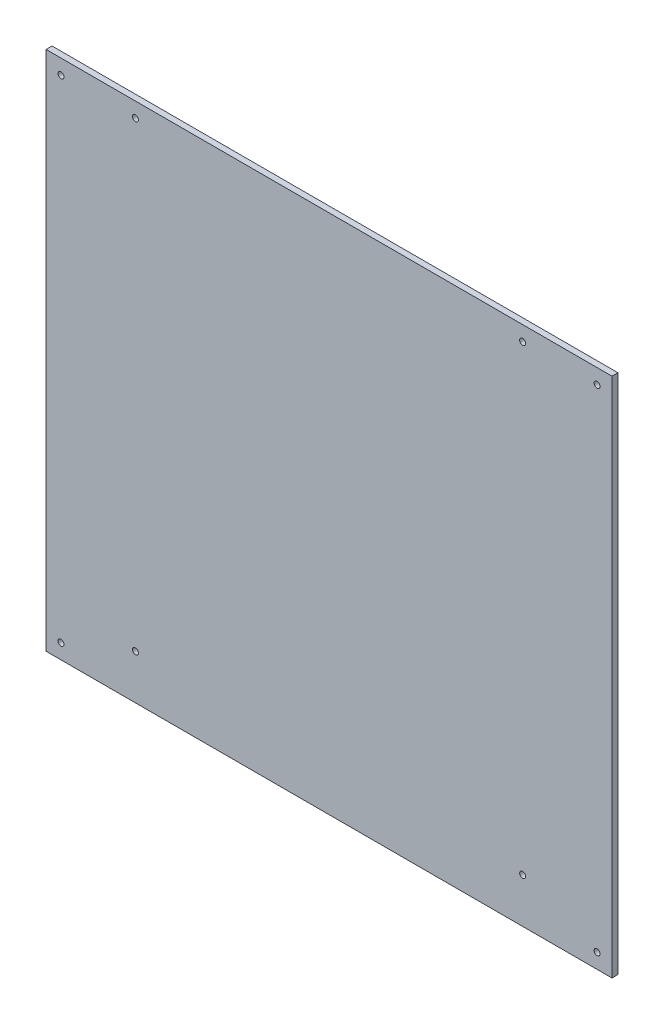
ISO-10303-21;
HEADER;
FILE_DESCRIPTION(('STEP AP214'),'2;1');
FILE_NAME('part.step','',(''),(''),'','','');
FILE_SCHEMA(('AUTOMOTIVE_DESIGN { 1 0 10303 214 1 1 1 1 }'));
ENDSEC;
DATA;
#1=APPLICATION_CONTEXT('core data for automotive mechanical design processes');
#2=APPLICATION_PROTOCOL_DEFINITION('international standard','automotive_design',2000,#1);
#3=PRODUCT_CONTEXT('',#1,'mechanical');
#4=PRODUCT('Part','Part','',(#3));
#5=PRODUCT_RELATED_PRODUCT_CATEGORY('part','',(#4));
#6=PRODUCT_DEFINITION_FORMATION('','',#4);
#7=PRODUCT_DEFINITION_CONTEXT('part definition',#1,'design');
#8=PRODUCT_DEFINITION('design','',#6,#7);
#9=PRODUCT_DEFINITION_SHAPE('','',#8);
#10=(LENGTH_UNIT() NAMED_UNIT(*) SI_UNIT(.MILLI.,.METRE.));
#11=(NAMED_UNIT(*) PLANE_ANGLE_UNIT() SI_UNIT($,.RADIAN.));
#12=(NAMED_UNIT(*) SI_UNIT($,.STERADIAN.) SOLID_ANGLE_UNIT());
#13=UNCERTAINTY_MEASURE_WITH_UNIT(LENGTH_MEASURE(1.E-05),#10,'distance_accuracy_value','');
#14=(GEOMETRIC_REPRESENTATION_CONTEXT(3) GLOBAL_UNCERTAINTY_ASSIGNED_CONTEXT((#13)) GLOBAL_UNIT_ASSIGNED_CONTEXT((#10,
#11,#12)) REPRESENTATION_CONTEXT('',''));
#15=CARTESIAN_POINT('',(0.,0.,0.));
#16=DIRECTION('',(0.,0.,1.));
#17=DIRECTION('',(1.,0.,0.));
#18=AXIS2_PLACEMENT_3D('',#15,#16,#17);
#19=CARTESIAN_POINT('',(0.,0.,4.));
#20=DIRECTION('',(0.,0.,1.));
#21=DIRECTION('',(1.,0.,0.));
#22=AXIS2_PLACEMENT_3D('',#19,#20,#21);
#23=PLANE('',#22);
#24=CARTESIAN_POINT('',(-179.999999999997,-165.,4.));
#25=DIRECTION('',(0.,0.,1.));
#26=DIRECTION('',(1.,0.,0.));
#27=AXIS2_PLACEMENT_3D('',#24,#25,#26);
#28=CIRCLE('',#27,2.);
#29=CARTESIAN_POINT('',(-177.999999999997,-165.,4.));
#30=VERTEX_POINT('',#29);
#31=EDGE_CURVE('E145',#30,#30,#28,.T.);
#32=ORIENTED_EDGE('',*,*,#31,.F.);
#33=EDGE_LOOP('',(#32));
#34=FACE_BOUND('',#33,.T.);
#35=CARTESIAN_POINT('',(180.,-165.,4.));
#36=DIRECTION('',(0.,0.,1.));
#37=DIRECTION('',(1.,0.,0.));
#38=AXIS2_PLACEMENT_3D('',#35,#36,#37);
#39=CIRCLE('',#38,2.);
#40=CARTESIAN_POINT('',(182.,-165.,4.));
#41=VERTEX_POINT('',#40);
#42=EDGE_CURVE('E133',#41,#41,#39,.T.);
#43=ORIENTED_EDGE('',*,*,#42,.F.);
#44=EDGE_LOOP('',(#43));
#45=FACE_BOUND('',#44,.T.);
#46=CARTESIAN_POINT('',(180.,165.,4.));
#47=DIRECTION('',(0.,0.,1.));
#48=DIRECTION('',(1.,0.,0.));
#49=AXIS2_PLACEMENT_3D('',#46,#47,#48);
#50=CIRCLE('',#49,2.);
#51=CARTESIAN_POINT('',(182.,165.,4.));
#52=VERTEX_POINT('',#51);
#53=EDGE_CURVE('E121',#52,#52,#50,.T.);
#54=ORIENTED_EDGE('',*,*,#53,.F.);
#55=EDGE_LOOP('',(#54));
#56=FACE_BOUND('',#55,.T.);
#57=CARTESIAN_POINT('',(-180.,165.,4.));
#58=DIRECTION('',(0.,0.,1.));
#59=DIRECTION('',(1.,0.,0.));
#60=AXIS2_PLACEMENT_3D('',#57,#58,#59);
#61=CIRCLE('',#60,2.);
#62=CARTESIAN_POINT('',(-178.,165.,4.));
#63=VERTEX_POINT('',#62);
#64=EDGE_CURVE('E100',#63,#63,#61,.T.);
#65=ORIENTED_EDGE('',*,*,#64,.F.);
#66=EDGE_LOOP('',(#65));
#67=FACE_BOUND('',#66,.T.);
#68=DIRECTION('',(0.,-1.,0.));
#69=VECTOR('',#68,1.);
#70=CARTESIAN_POINT('',(-190.,-175.,4.));
#71=LINE('',#70,#69);
#72=CARTESIAN_POINT('',(-190.,175.,4.));
#73=VERTEX_POINT('',#72);
#74=CARTESIAN_POINT('',(-190.,-175.,4.));
#75=VERTEX_POINT('',#74);
#76=EDGE_CURVE('E85',#73,#75,#71,.T.);
#77=ORIENTED_EDGE('',*,*,#76,.T.);
#78=DIRECTION('',(1.,0.,0.));
#79=VECTOR('',#78,1.);
#80=CARTESIAN_POINT('',(190.,-175.,4.));
#81=LINE('',#80,#79);
#82=CARTESIAN_POINT('',(190.,-175.,4.));
#83=VERTEX_POINT('',#82);
#84=EDGE_CURVE('E80',#75,#83,#81,.T.);
#85=ORIENTED_EDGE('',*,*,#84,.T.);
#86=DIRECTION('',(0.,1.,0.));
#87=VECTOR('',#86,1.);
#88=CARTESIAN_POINT('',(190.,-175.,4.));
#89=LINE('',#88,#87);
#90=CARTESIAN_POINT('',(190.,175.,4.));
#91=VERTEX_POINT('',#90);
#92=EDGE_CURVE('E83',#83,#91,#89,.T.);
#93=ORIENTED_EDGE('',*,*,#92,.T.);
#94=DIRECTION('',(-1.,0.,0.));
#95=VECTOR('',#94,1.);
#96=CARTESIAN_POINT('',(190.,175.,4.));
#97=LINE('',#96,#95);
#98=EDGE_CURVE('E50',#91,#73,#97,.T.);
#99=ORIENTED_EDGE('',*,*,#98,.T.);
#100=EDGE_LOOP('',(#77,#85,#93,#99));
#101=FACE_BOUND('',#100,.T.);
#102=CARTESIAN_POINT('',(-130.,165.,4.));
#103=DIRECTION('',(0.,0.,1.));
#104=DIRECTION('',(1.,0.,0.));
#105=AXIS2_PLACEMENT_3D('',#102,#103,#104);
#106=CIRCLE('',#105,2.);
#107=CARTESIAN_POINT('',(-128.,165.,4.));
#108=VERTEX_POINT('',#107);
#109=EDGE_CURVE('E115',#108,#108,#106,.T.);
#110=ORIENTED_EDGE('',*,*,#109,.F.);
#111=EDGE_LOOP('',(#110));
#112=FACE_BOUND('',#111,.T.);
#113=CARTESIAN_POINT('',(130.,165.,4.));
#114=DIRECTION('',(0.,0.,1.));
#115=DIRECTION('',(1.,0.,0.));
#116=AXIS2_PLACEMENT_3D('',#113,#114,#115);
#117=CIRCLE('',#116,2.);
#118=CARTESIAN_POINT('',(132.,165.,4.));
#119=VERTEX_POINT('',#118);
#120=EDGE_CURVE('E127',#119,#119,#117,.T.);
#121=ORIENTED_EDGE('',*,*,#120,.F.);
#122=EDGE_LOOP('',(#121));
#123=FACE_BOUND('',#122,.T.);
#124=CARTESIAN_POINT('',(130.,-145.,4.));
#125=DIRECTION('',(0.,0.,1.));
#126=DIRECTION('',(1.,0.,0.));
#127=AXIS2_PLACEMENT_3D('',#124,#125,#126);
#128=CIRCLE('',#127,2.);
#129=CARTESIAN_POINT('',(132.,-145.,4.));
#130=VERTEX_POINT('',#129);
#131=EDGE_CURVE('E139',#130,#130,#128,.T.);
#132=ORIENTED_EDGE('',*,*,#131,.F.);
#133=EDGE_LOOP('',(#132));
#134=FACE_BOUND('',#133,.T.);
#135=CARTESIAN_POINT('',(-129.999999999997,-145.,4.));
#136=DIRECTION('',(0.,0.,1.));
#137=DIRECTION('',(1.,0.,0.));
#138=AXIS2_PLACEMENT_3D('',#135,#136,#137);
#139=CIRCLE('',#138,2.);
#140=CARTESIAN_POINT('',(-127.999999999997,-145.,4.));
#141=VERTEX_POINT('',#140);
#142=EDGE_CURVE('E151',#141,#141,#139,.T.);
#143=ORIENTED_EDGE('',*,*,#142,.F.);
#144=EDGE_LOOP('',(#143));
#145=FACE_BOUND('',#144,.T.);
#146=ADVANCED_FACE('F33',(#34,#45,#56,#67,#101,#112,#123,#134,#145),#23,.T.);
#147=CARTESIAN_POINT('',(0.,0.,0.));
#148=DIRECTION('',(0.,0.,1.));
#149=DIRECTION('',(1.,0.,0.));
#150=AXIS2_PLACEMENT_3D('',#147,#148,#149);
#151=PLANE('',#150);
#152=DIRECTION('',(0.,-1.,0.));
#153=VECTOR('',#152,1.);
#154=CARTESIAN_POINT('',(-190.,-175.,0.));
#155=LINE('',#154,#153);
#156=CARTESIAN_POINT('',(-190.,175.,0.));
#157=VERTEX_POINT('',#156);
#158=CARTESIAN_POINT('',(-190.,-175.,0.));
#159=VERTEX_POINT('',#158);
#160=EDGE_CURVE('E97',#157,#159,#155,.T.);
#161=ORIENTED_EDGE('',*,*,#160,.F.);
#162=DIRECTION('',(-1.,0.,0.));
#163=VECTOR('',#162,1.);
#164=CARTESIAN_POINT('',(190.,175.,0.));
#165=LINE('',#164,#163);
#166=CARTESIAN_POINT('',(190.,175.,0.));
#167=VERTEX_POINT('',#166);
#168=EDGE_CURVE('E73',#167,#157,#165,.T.);
#169=ORIENTED_EDGE('',*,*,#168,.F.);
#170=DIRECTION('',(0.,1.,0.));
#171=VECTOR('',#170,1.);
#172=CARTESIAN_POINT('',(190.,-175.,0.));
#173=LINE('',#172,#171);
#174=CARTESIAN_POINT('',(190.,-175.,0.));
#175=VERTEX_POINT('',#174);
#176=EDGE_CURVE('E67',#175,#167,#173,.T.);
#177=ORIENTED_EDGE('',*,*,#176,.F.);
#178=DIRECTION('',(1.,0.,0.));
#179=VECTOR('',#178,1.);
#180=CARTESIAN_POINT('',(190.,-175.,0.));
#181=LINE('',#180,#179);
#182=EDGE_CURVE('E89',#159,#175,#181,.T.);
#183=ORIENTED_EDGE('',*,*,#182,.F.);
#184=EDGE_LOOP('',(#161,#169,#177,#183));
#185=FACE_BOUND('',#184,.T.);
#186=CARTESIAN_POINT('',(-180.,165.,0.));
#187=DIRECTION('',(0.,0.,1.));
#188=DIRECTION('',(1.,0.,0.));
#189=AXIS2_PLACEMENT_3D('',#186,#187,#188);
#190=CIRCLE('',#189,2.);
#191=CARTESIAN_POINT('',(-178.,165.,0.));
#192=VERTEX_POINT('',#191);
#193=EDGE_CURVE('E112',#192,#192,#190,.T.);
#194=ORIENTED_EDGE('',*,*,#193,.T.);
#195=EDGE_LOOP('',(#194));
#196=FACE_BOUND('',#195,.T.);
#197=CARTESIAN_POINT('',(-130.,165.,0.));
#198=DIRECTION('',(0.,0.,1.));
#199=DIRECTION('',(1.,0.,0.));
#200=AXIS2_PLACEMENT_3D('',#197,#198,#199);
#201=CIRCLE('',#200,2.);
#202=CARTESIAN_POINT('',(-128.,165.,0.));
#203=VERTEX_POINT('',#202);
#204=EDGE_CURVE('E118',#203,#203,#201,.T.);
#205=ORIENTED_EDGE('',*,*,#204,.T.);
#206=EDGE_LOOP('',(#205));
#207=FACE_BOUND('',#206,.T.);
#208=CARTESIAN_POINT('',(180.,165.,0.));
#209=DIRECTION('',(0.,0.,1.));
#210=DIRECTION('',(1.,0.,0.));
#211=AXIS2_PLACEMENT_3D('',#208,#209,#210);
#212=CIRCLE('',#211,2.);
#213=CARTESIAN_POINT('',(182.,165.,0.));
#214=VERTEX_POINT('',#213);
#215=EDGE_CURVE('E124',#214,#214,#212,.T.);
#216=ORIENTED_EDGE('',*,*,#215,.T.);
#217=EDGE_LOOP('',(#216));
#218=FACE_BOUND('',#217,.T.);
#219=CARTESIAN_POINT('',(130.,165.,0.));
#220=DIRECTION('',(0.,0.,1.));
#221=DIRECTION('',(1.,0.,0.));
#222=AXIS2_PLACEMENT_3D('',#219,#220,#221);
#223=CIRCLE('',#222,2.);
#224=CARTESIAN_POINT('',(132.,165.,0.));
#225=VERTEX_POINT('',#224);
#226=EDGE_CURVE('E130',#225,#225,#223,.T.);
#227=ORIENTED_EDGE('',*,*,#226,.T.);
#228=EDGE_LOOP('',(#227));
#229=FACE_BOUND('',#228,.T.);
#230=CARTESIAN_POINT('',(180.,-165.,0.));
#231=DIRECTION('',(0.,0.,1.));
#232=DIRECTION('',(1.,0.,0.));
#233=AXIS2_PLACEMENT_3D('',#230,#231,#232);
#234=CIRCLE('',#233,2.);
#235=CARTESIAN_POINT('',(182.,-165.,0.));
#236=VERTEX_POINT('',#235);
#237=EDGE_CURVE('E136',#236,#236,#234,.T.);
#238=ORIENTED_EDGE('',*,*,#237,.T.);
#239=EDGE_LOOP('',(#238));
#240=FACE_BOUND('',#239,.T.);
#241=CARTESIAN_POINT('',(130.,-145.,0.));
#242=DIRECTION('',(0.,0.,1.));
#243=DIRECTION('',(1.,0.,0.));
#244=AXIS2_PLACEMENT_3D('',#241,#242,#243);
#245=CIRCLE('',#244,2.);
#246=CARTESIAN_POINT('',(132.,-145.,0.));
#247=VERTEX_POINT('',#246);
#248=EDGE_CURVE('E142',#247,#247,#245,.T.);
#249=ORIENTED_EDGE('',*,*,#248,.T.);
#250=EDGE_LOOP('',(#249));
#251=FACE_BOUND('',#250,.T.);
#252=CARTESIAN_POINT('',(-179.999999999997,-165.,0.));
#253=DIRECTION('',(0.,0.,1.));
#254=DIRECTION('',(1.,0.,0.));
#255=AXIS2_PLACEMENT_3D('',#252,#253,#254);
#256=CIRCLE('',#255,2.);
#257=CARTESIAN_POINT('',(-177.999999999997,-165.,0.));
#258=VERTEX_POINT('',#257);
#259=EDGE_CURVE('E148',#258,#258,#256,.T.);
#260=ORIENTED_EDGE('',*,*,#259,.T.);
#261=EDGE_LOOP('',(#260));
#262=FACE_BOUND('',#261,.T.);
#263=CARTESIAN_POINT('',(-129.999999999997,-145.,0.));
#264=DIRECTION('',(0.,0.,1.));
#265=DIRECTION('',(1.,0.,0.));
#266=AXIS2_PLACEMENT_3D('',#263,#264,#265);
#267=CIRCLE('',#266,2.);
#268=CARTESIAN_POINT('',(-127.999999999997,-145.,0.));
#269=VERTEX_POINT('',#268);
#270=EDGE_CURVE('E154',#269,#269,#267,.T.);
#271=ORIENTED_EDGE('',*,*,#270,.T.);
#272=EDGE_LOOP('',(#271));
#273=FACE_BOUND('',#272,.T.);
#274=ADVANCED_FACE('F108',(#185,#196,#207,#218,#229,#240,#251,#262,#273),#151,.F.);
#275=CARTESIAN_POINT('',(-190.,-175.,4.));
#276=DIRECTION('',(1.,0.,0.));
#277=DIRECTION('',(0.,0.,-1.));
#278=AXIS2_PLACEMENT_3D('',#275,#276,#277);
#279=PLANE('',#278);
#280=ORIENTED_EDGE('',*,*,#160,.T.);
#281=DIRECTION('',(0.,0.,-1.));
#282=VECTOR('',#281,1.);
#283=CARTESIAN_POINT('',(-190.,-175.,4.));
#284=LINE('',#283,#282);
#285=EDGE_CURVE('E11',#75,#159,#284,.T.);
#286=ORIENTED_EDGE('',*,*,#285,.F.);
#287=ORIENTED_EDGE('',*,*,#76,.F.);
#288=DIRECTION('',(0.,0.,-1.));
#289=VECTOR('',#288,1.);
#290=CARTESIAN_POINT('',(-190.,175.,4.));
#291=LINE('',#290,#289);
#292=EDGE_CURVE('E93',#73,#157,#291,.T.);
#293=ORIENTED_EDGE('',*,*,#292,.T.);
#294=EDGE_LOOP('',(#280,#286,#287,#293));
#295=FACE_BOUND('',#294,.T.);
#296=ADVANCED_FACE('F35',(#295),#279,.F.);
#297=CARTESIAN_POINT('',(190.,-175.,4.));
#298=DIRECTION('',(0.,1.,0.));
#299=DIRECTION('',(-1.,0.,0.));
#300=AXIS2_PLACEMENT_3D('',#297,#298,#299);
#301=PLANE('',#300);
#302=ORIENTED_EDGE('',*,*,#182,.T.);
#303=DIRECTION('',(0.,0.,-1.));
#304=VECTOR('',#303,1.);
#305=CARTESIAN_POINT('',(190.,-175.,4.));
#306=LINE('',#305,#304);
#307=EDGE_CURVE('E42',#83,#175,#306,.T.);
#308=ORIENTED_EDGE('',*,*,#307,.F.);
#309=ORIENTED_EDGE('',*,*,#84,.F.);
#310=ORIENTED_EDGE('',*,*,#285,.T.);
#311=EDGE_LOOP('',(#302,#308,#309,#310));
#312=FACE_BOUND('',#311,.T.);
#313=ADVANCED_FACE('F88',(#312),#301,.F.);
#314=CARTESIAN_POINT('',(190.,-175.,4.));
#315=DIRECTION('',(-1.,0.,0.));
#316=DIRECTION('',(0.,0.,1.));
#317=AXIS2_PLACEMENT_3D('',#314,#315,#316);
#318=PLANE('',#317);
#319=ORIENTED_EDGE('',*,*,#176,.T.);
#320=DIRECTION('',(0.,0.,-1.));
#321=VECTOR('',#320,1.);
#322=CARTESIAN_POINT('',(190.,175.,4.));
#323=LINE('',#322,#321);
#324=EDGE_CURVE('E90',#91,#167,#323,.T.);
#325=ORIENTED_EDGE('',*,*,#324,.F.);
#326=ORIENTED_EDGE('',*,*,#92,.F.);
#327=ORIENTED_EDGE('',*,*,#307,.T.);
#328=EDGE_LOOP('',(#319,#325,#326,#327));
#329=FACE_BOUND('',#328,.T.);
#330=ADVANCED_FACE('F91',(#329),#318,.F.);
#331=CARTESIAN_POINT('',(190.,175.,4.));
#332=DIRECTION('',(0.,-1.,0.));
#333=DIRECTION('',(1.,0.,0.));
#334=AXIS2_PLACEMENT_3D('',#331,#332,#333);
#335=PLANE('',#334);
#336=ORIENTED_EDGE('',*,*,#168,.T.);
#337=ORIENTED_EDGE('',*,*,#292,.F.);
#338=ORIENTED_EDGE('',*,*,#98,.F.);
#339=ORIENTED_EDGE('',*,*,#324,.T.);
#340=EDGE_LOOP('',(#336,#337,#338,#339));
#341=FACE_BOUND('',#340,.T.);
#342=ADVANCED_FACE('F105',(#341),#335,.F.);
#343=CARTESIAN_POINT('',(-180.,165.,4.));
#344=DIRECTION('',(0.,0.,-1.));
#345=DIRECTION('',(-1.,0.,0.));
#346=AXIS2_PLACEMENT_3D('',#343,#344,#345);
#347=CYLINDRICAL_SURFACE('',#346,2.);
#348=ORIENTED_EDGE('',*,*,#64,.T.);
#349=EDGE_LOOP('',(#348));
#350=FACE_BOUND('',#349,.T.);
#351=ORIENTED_EDGE('',*,*,#193,.F.);
#352=EDGE_LOOP('',(#351));
#353=FACE_BOUND('',#352,.T.);
#354=ADVANCED_FACE('F173',(#350,#353),#347,.F.);
#355=CARTESIAN_POINT('',(-130.,165.,4.));
#356=DIRECTION('',(0.,0.,-1.));
#357=DIRECTION('',(-1.,0.,0.));
#358=AXIS2_PLACEMENT_3D('',#355,#356,#357);
#359=CYLINDRICAL_SURFACE('',#358,2.);
#360=ORIENTED_EDGE('',*,*,#109,.T.);
#361=EDGE_LOOP('',(#360));
#362=FACE_BOUND('',#361,.T.);
#363=ORIENTED_EDGE('',*,*,#204,.F.);
#364=EDGE_LOOP('',(#363));
#365=FACE_BOUND('',#364,.T.);
#366=ADVANCED_FACE('F219',(#362,#365),#359,.F.);
#367=CARTESIAN_POINT('',(180.,165.,4.));
#368=DIRECTION('',(0.,0.,-1.));
#369=DIRECTION('',(-1.,0.,0.));
#370=AXIS2_PLACEMENT_3D('',#367,#368,#369);
#371=CYLINDRICAL_SURFACE('',#370,2.);
#372=ORIENTED_EDGE('',*,*,#53,.T.);
#373=EDGE_LOOP('',(#372));
#374=FACE_BOUND('',#373,.T.);
#375=ORIENTED_EDGE('',*,*,#215,.F.);
#376=EDGE_LOOP('',(#375));
#377=FACE_BOUND('',#376,.T.);
#378=ADVANCED_FACE('F227',(#374,#377),#371,.F.);
#379=CARTESIAN_POINT('',(130.,165.,4.));
#380=DIRECTION('',(0.,0.,-1.));
#381=DIRECTION('',(-1.,0.,0.));
#382=AXIS2_PLACEMENT_3D('',#379,#380,#381);
#383=CYLINDRICAL_SURFACE('',#382,2.);
#384=ORIENTED_EDGE('',*,*,#120,.T.);
#385=EDGE_LOOP('',(#384));
#386=FACE_BOUND('',#385,.T.);
#387=ORIENTED_EDGE('',*,*,#226,.F.);
#388=EDGE_LOOP('',(#387));
#389=FACE_BOUND('',#388,.T.);
#390=ADVANCED_FACE('F235',(#386,#389),#383,.F.);
#391=CARTESIAN_POINT('',(180.,-165.,4.));
#392=DIRECTION('',(0.,0.,-1.));
#393=DIRECTION('',(-1.,0.,0.));
#394=AXIS2_PLACEMENT_3D('',#391,#392,#393);
#395=CYLINDRICAL_SURFACE('',#394,2.);
#396=ORIENTED_EDGE('',*,*,#42,.T.);
#397=EDGE_LOOP('',(#396));
#398=FACE_BOUND('',#397,.T.);
#399=ORIENTED_EDGE('',*,*,#237,.F.);
#400=EDGE_LOOP('',(#399));
#401=FACE_BOUND('',#400,.T.);
#402=ADVANCED_FACE('F244',(#398,#401),#395,.F.);
#403=CARTESIAN_POINT('',(130.,-145.,4.));
#404=DIRECTION('',(0.,0.,-1.));
#405=DIRECTION('',(-1.,0.,0.));
#406=AXIS2_PLACEMENT_3D('',#403,#404,#405);
#407=CYLINDRICAL_SURFACE('',#406,2.);
#408=ORIENTED_EDGE('',*,*,#131,.T.);
#409=EDGE_LOOP('',(#408));
#410=FACE_BOUND('',#409,.T.);
#411=ORIENTED_EDGE('',*,*,#248,.F.);
#412=EDGE_LOOP('',(#411));
#413=FACE_BOUND('',#412,.T.);
#414=ADVANCED_FACE('F253',(#410,#413),#407,.F.);
#415=CARTESIAN_POINT('',(-179.999999999997,-165.,4.));
#416=DIRECTION('',(0.,0.,-1.));
#417=DIRECTION('',(-1.,0.,0.));
#418=AXIS2_PLACEMENT_3D('',#415,#416,#417);
#419=CYLINDRICAL_SURFACE('',#418,2.);
#420=ORIENTED_EDGE('',*,*,#31,.T.);
#421=EDGE_LOOP('',(#420));
#422=FACE_BOUND('',#421,.T.);
#423=ORIENTED_EDGE('',*,*,#259,.F.);
#424=EDGE_LOOP('',(#423));
#425=FACE_BOUND('',#424,.T.);
#426=ADVANCED_FACE('F262',(#422,#425),#419,.F.);
#427=CARTESIAN_POINT('',(-129.999999999997,-145.,4.));
#428=DIRECTION('',(0.,0.,-1.));
#429=DIRECTION('',(-1.,0.,0.));
#430=AXIS2_PLACEMENT_3D('',#427,#428,#429);
#431=CYLINDRICAL_SURFACE('',#430,2.);
#432=ORIENTED_EDGE('',*,*,#142,.T.);
#433=EDGE_LOOP('',(#432));
#434=FACE_BOUND('',#433,.T.);
#435=ORIENTED_EDGE('',*,*,#270,.F.);
#436=EDGE_LOOP('',(#435));
#437=FACE_BOUND('',#436,.T.);
#438=ADVANCED_FACE('F160',(#434,#437),#431,.F.);
#439=CLOSED_SHELL('',(#146,#274,#296,#313,#330,#342,#354,#366,#378,#390,#402,#414,#426,#438));
#440=MANIFOLD_SOLID_BREP('B2',#439);
#441=ADVANCED_BREP_SHAPE_REPRESENTATION('',(#18,#440),#14);
#442=SHAPE_DEFINITION_REPRESENTATION(#9,#441);
ENDSEC;
END-ISO-10303-21;
